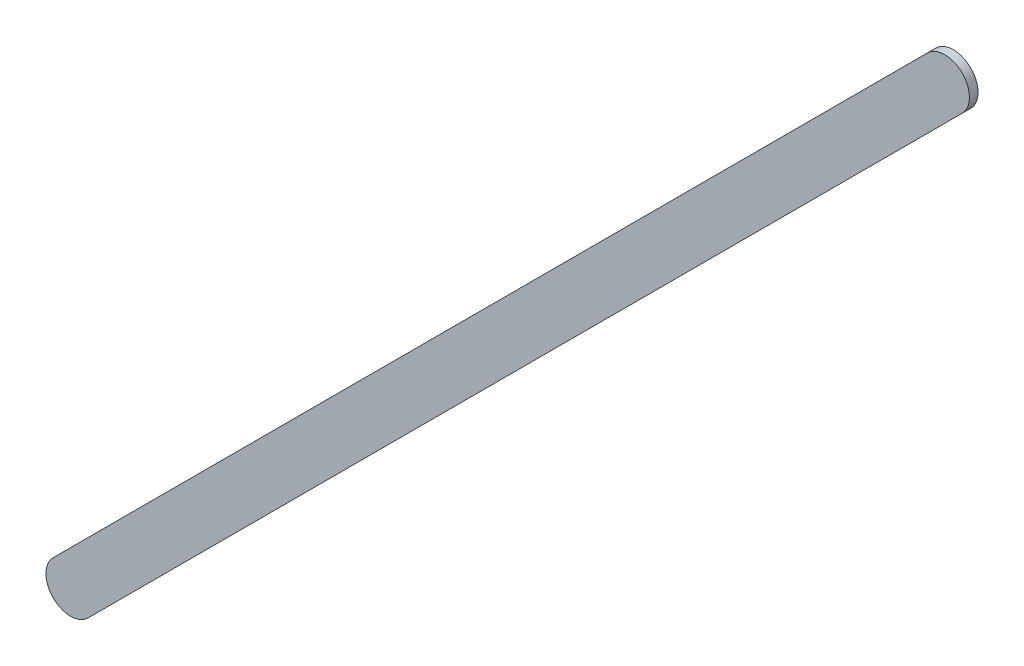
ISO-10303-21;
HEADER;
FILE_DESCRIPTION(('STEP AP214'),'2;1');
FILE_NAME('part.step','',(''),(''),'','','');
FILE_SCHEMA(('AUTOMOTIVE_DESIGN { 1 0 10303 214 1 1 1 1 }'));
ENDSEC;
DATA;
#1=APPLICATION_CONTEXT('core data for automotive mechanical design processes');
#2=APPLICATION_PROTOCOL_DEFINITION('international standard','automotive_design',2000,#1);
#3=PRODUCT_CONTEXT('',#1,'mechanical');
#4=PRODUCT('Part','Part','',(#3));
#5=PRODUCT_RELATED_PRODUCT_CATEGORY('part','',(#4));
#6=PRODUCT_DEFINITION_FORMATION('','',#4);
#7=PRODUCT_DEFINITION_CONTEXT('part definition',#1,'design');
#8=PRODUCT_DEFINITION('design','',#6,#7);
#9=PRODUCT_DEFINITION_SHAPE('','',#8);
#10=(LENGTH_UNIT() NAMED_UNIT(*) SI_UNIT(.MILLI.,.METRE.));
#11=(NAMED_UNIT(*) PLANE_ANGLE_UNIT() SI_UNIT($,.RADIAN.));
#12=(NAMED_UNIT(*) SI_UNIT($,.STERADIAN.) SOLID_ANGLE_UNIT());
#13=UNCERTAINTY_MEASURE_WITH_UNIT(LENGTH_MEASURE(1.E-05),#10,'distance_accuracy_value','');
#14=(GEOMETRIC_REPRESENTATION_CONTEXT(3) GLOBAL_UNCERTAINTY_ASSIGNED_CONTEXT((#13)) GLOBAL_UNIT_ASSIGNED_CONTEXT((#10,
#11,#12)) REPRESENTATION_CONTEXT('',''));
#15=CARTESIAN_POINT('',(0.,0.,0.));
#16=DIRECTION('',(0.,0.,1.));
#17=DIRECTION('',(1.,0.,0.));
#18=AXIS2_PLACEMENT_3D('',#15,#16,#17);
#19=CARTESIAN_POINT('',(93.52071,-120.12071,1.635));
#20=DIRECTION('',(0.,0.,1.));
#21=DIRECTION('',(1.,0.,0.));
#22=AXIS2_PLACEMENT_3D('',#19,#20,#21);
#23=PLANE('',#22);
#24=DIRECTION('',(0.707106781186548,0.707106781186548,0.));
#25=VECTOR('',#24,1.);
#26=CARTESIAN_POINT('',(93.52071,-120.12071,1.635));
#27=LINE('',#26,#25);
#28=CARTESIAN_POINT('',(93.52071,-120.12071,1.635));
#29=VERTEX_POINT('',#28);
#30=CARTESIAN_POINT('',(97.07071,-116.57071,1.635));
#31=VERTEX_POINT('',#30);
#32=EDGE_CURVE('E82',#29,#31,#27,.T.);
#33=ORIENTED_EDGE('',*,*,#32,.T.);
#34=CARTESIAN_POINT('',(96.9999995,-116.4999995,1.635));
#35=DIRECTION('',(0.,0.,1.));
#36=DIRECTION('',(0.707106781186548,-0.707106781186548,0.));
#37=AXIS2_PLACEMENT_3D('',#34,#35,#36);
#38=CIRCLE('',#37,0.09999974810219);
#39=CARTESIAN_POINT('',(96.929289,-116.429289,1.635));
#40=VERTEX_POINT('',#39);
#41=EDGE_CURVE('E98',#31,#40,#38,.T.);
#42=ORIENTED_EDGE('',*,*,#41,.T.);
#43=DIRECTION('',(-0.707106781186548,-0.707106781186548,0.));
#44=VECTOR('',#43,1.);
#45=CARTESIAN_POINT('',(96.929289,-116.429289,1.635));
#46=LINE('',#45,#44);
#47=CARTESIAN_POINT('',(93.379289,-119.979289,1.635));
#48=VERTEX_POINT('',#47);
#49=EDGE_CURVE('E75',#40,#48,#46,.T.);
#50=ORIENTED_EDGE('',*,*,#49,.T.);
#51=CARTESIAN_POINT('',(93.4499995,-120.0499995,1.635));
#52=DIRECTION('',(0.,0.,1.));
#53=DIRECTION('',(-0.707106781186048,0.707106781187048,0.));
#54=AXIS2_PLACEMENT_3D('',#51,#52,#53);
#55=CIRCLE('',#54,0.09999974810218);
#56=EDGE_CURVE('E11',#48,#29,#55,.T.);
#57=ORIENTED_EDGE('',*,*,#56,.T.);
#58=EDGE_LOOP('',(#33,#42,#50,#57));
#59=FACE_BOUND('',#58,.T.);
#60=ADVANCED_FACE('F17',(#59),#23,.T.);
#61=CARTESIAN_POINT('',(93.52071,-120.12071,1.6));
#62=DIRECTION('',(0.,0.,1.));
#63=DIRECTION('',(1.,0.,0.));
#64=AXIS2_PLACEMENT_3D('',#61,#62,#63);
#65=PLANE('',#64);
#66=CARTESIAN_POINT('',(93.4499995,-120.0499995,1.6));
#67=DIRECTION('',(0.,0.,1.));
#68=DIRECTION('',(-0.707106781186048,0.707106781187048,0.));
#69=AXIS2_PLACEMENT_3D('',#66,#67,#68);
#70=CIRCLE('',#69,0.09999974810218);
#71=CARTESIAN_POINT('',(93.379289,-119.979289,1.6));
#72=VERTEX_POINT('',#71);
#73=CARTESIAN_POINT('',(93.52071,-120.12071,1.6));
#74=VERTEX_POINT('',#73);
#75=EDGE_CURVE('E20',#72,#74,#70,.T.);
#76=ORIENTED_EDGE('',*,*,#75,.F.);
#77=DIRECTION('',(-0.707106781186548,-0.707106781186548,0.));
#78=VECTOR('',#77,1.);
#79=CARTESIAN_POINT('',(96.929289,-116.429289,1.6));
#80=LINE('',#79,#78);
#81=CARTESIAN_POINT('',(96.929289,-116.429289,1.6));
#82=VERTEX_POINT('',#81);
#83=EDGE_CURVE('E110',#82,#72,#80,.T.);
#84=ORIENTED_EDGE('',*,*,#83,.F.);
#85=CARTESIAN_POINT('',(96.9999995,-116.4999995,1.6));
#86=DIRECTION('',(0.,0.,1.));
#87=DIRECTION('',(0.707106781186548,-0.707106781186548,0.));
#88=AXIS2_PLACEMENT_3D('',#85,#86,#87);
#89=CIRCLE('',#88,0.09999974810219);
#90=CARTESIAN_POINT('',(97.07071,-116.57071,1.6));
#91=VERTEX_POINT('',#90);
#92=EDGE_CURVE('E84',#91,#82,#89,.T.);
#93=ORIENTED_EDGE('',*,*,#92,.F.);
#94=DIRECTION('',(0.707106781186548,0.707106781186548,0.));
#95=VECTOR('',#94,1.);
#96=CARTESIAN_POINT('',(93.52071,-120.12071,1.6));
#97=LINE('',#96,#95);
#98=EDGE_CURVE('E80',#74,#91,#97,.T.);
#99=ORIENTED_EDGE('',*,*,#98,.F.);
#100=EDGE_LOOP('',(#76,#84,#93,#99));
#101=FACE_BOUND('',#100,.T.);
#102=ADVANCED_FACE('F86',(#101),#65,.F.);
#103=CARTESIAN_POINT('',(93.4499995,-120.0499995,1.6));
#104=DIRECTION('',(0.,0.,-1.));
#105=DIRECTION('',(-0.707106781186048,0.707106781187048,0.));
#106=AXIS2_PLACEMENT_3D('',#103,#104,#105);
#107=CYLINDRICAL_SURFACE('',#106,0.09999974810218);
#108=ORIENTED_EDGE('',*,*,#75,.T.);
#109=DIRECTION('',(0.,0.,1.));
#110=VECTOR('',#109,1.);
#111=CARTESIAN_POINT('',(93.52071,-120.12071,1.6));
#112=LINE('',#111,#110);
#113=EDGE_CURVE('E69',#74,#29,#112,.T.);
#114=ORIENTED_EDGE('',*,*,#113,.T.);
#115=ORIENTED_EDGE('',*,*,#56,.F.);
#116=DIRECTION('',(0.,0.,1.));
#117=VECTOR('',#116,1.);
#118=CARTESIAN_POINT('',(93.379289,-119.979289,1.6));
#119=LINE('',#118,#117);
#120=EDGE_CURVE('E72',#72,#48,#119,.T.);
#121=ORIENTED_EDGE('',*,*,#120,.F.);
#122=EDGE_LOOP('',(#108,#114,#115,#121));
#123=FACE_BOUND('',#122,.T.);
#124=ADVANCED_FACE('F68',(#123),#107,.T.);
#125=CARTESIAN_POINT('',(96.929289,-116.429289,1.6));
#126=DIRECTION('',(0.707106781186548,-0.707106781186548,0.));
#127=DIRECTION('',(0.,0.,-1.));
#128=AXIS2_PLACEMENT_3D('',#125,#126,#127);
#129=PLANE('',#128);
#130=ORIENTED_EDGE('',*,*,#83,.T.);
#131=ORIENTED_EDGE('',*,*,#120,.T.);
#132=ORIENTED_EDGE('',*,*,#49,.F.);
#133=DIRECTION('',(0.,0.,1.));
#134=VECTOR('',#133,1.);
#135=CARTESIAN_POINT('',(96.929289,-116.429289,1.6));
#136=LINE('',#135,#134);
#137=EDGE_CURVE('E104',#82,#40,#136,.T.);
#138=ORIENTED_EDGE('',*,*,#137,.F.);
#139=EDGE_LOOP('',(#130,#131,#132,#138));
#140=FACE_BOUND('',#139,.T.);
#141=ADVANCED_FACE('F116',(#140),#129,.F.);
#142=CARTESIAN_POINT('',(96.9999995,-116.4999995,1.6));
#143=DIRECTION('',(0.,0.,-1.));
#144=DIRECTION('',(0.707106781186548,-0.707106781186548,0.));
#145=AXIS2_PLACEMENT_3D('',#142,#143,#144);
#146=CYLINDRICAL_SURFACE('',#145,0.09999974810219);
#147=ORIENTED_EDGE('',*,*,#92,.T.);
#148=ORIENTED_EDGE('',*,*,#137,.T.);
#149=ORIENTED_EDGE('',*,*,#41,.F.);
#150=DIRECTION('',(0.,0.,1.));
#151=VECTOR('',#150,1.);
#152=CARTESIAN_POINT('',(97.07071,-116.57071,1.6));
#153=LINE('',#152,#151);
#154=EDGE_CURVE('E90',#91,#31,#153,.T.);
#155=ORIENTED_EDGE('',*,*,#154,.F.);
#156=EDGE_LOOP('',(#147,#148,#149,#155));
#157=FACE_BOUND('',#156,.T.);
#158=ADVANCED_FACE('F120',(#157),#146,.T.);
#159=CARTESIAN_POINT('',(93.52071,-120.12071,1.6));
#160=DIRECTION('',(-0.707106781186548,0.707106781186548,0.));
#161=DIRECTION('',(0.,0.,1.));
#162=AXIS2_PLACEMENT_3D('',#159,#160,#161);
#163=PLANE('',#162);
#164=ORIENTED_EDGE('',*,*,#98,.T.);
#165=ORIENTED_EDGE('',*,*,#154,.T.);
#166=ORIENTED_EDGE('',*,*,#32,.F.);
#167=ORIENTED_EDGE('',*,*,#113,.F.);
#168=EDGE_LOOP('',(#164,#165,#166,#167));
#169=FACE_BOUND('',#168,.T.);
#170=ADVANCED_FACE('F78',(#169),#163,.F.);
#171=CLOSED_SHELL('',(#60,#102,#124,#141,#158,#170));
#172=MANIFOLD_SOLID_BREP('B1',#171);
#173=ADVANCED_BREP_SHAPE_REPRESENTATION('',(#18,#172),#14);
#174=SHAPE_DEFINITION_REPRESENTATION(#9,#173);
ENDSEC;
END-ISO-10303-21;
